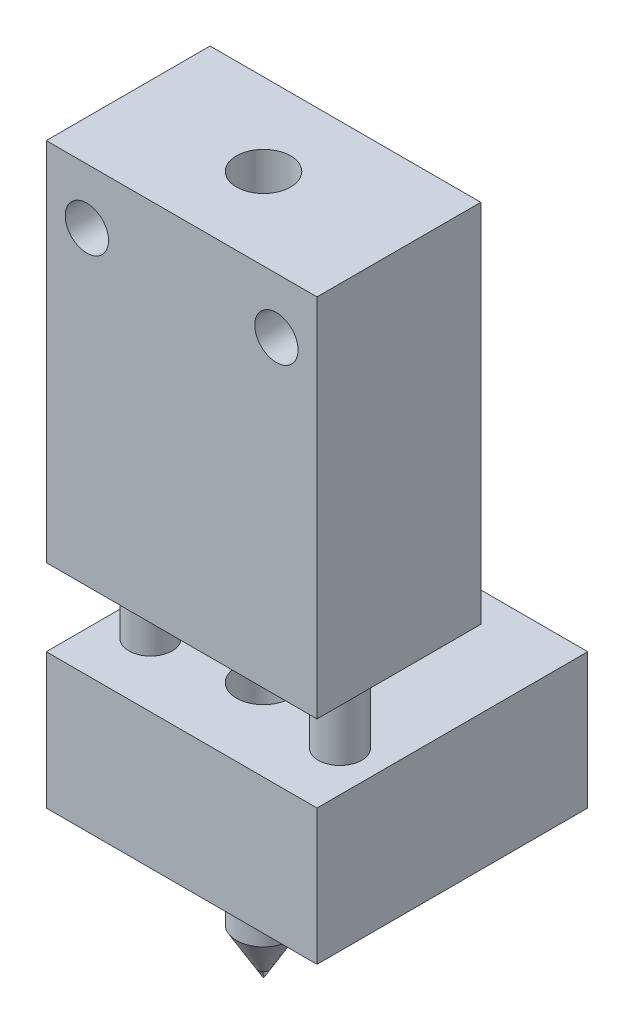
ISO-10303-21;
HEADER;
FILE_DESCRIPTION(('STEP AP214'),'2;1');
FILE_NAME('part.step','',(''),(''),'','','');
FILE_SCHEMA(('AUTOMOTIVE_DESIGN { 1 0 10303 214 1 1 1 1 }'));
ENDSEC;
DATA;
#1=APPLICATION_CONTEXT('core data for automotive mechanical design processes');
#2=APPLICATION_PROTOCOL_DEFINITION('international standard','automotive_design',2000,#1);
#3=PRODUCT_CONTEXT('',#1,'mechanical');
#4=PRODUCT('Part','Part','',(#3));
#5=PRODUCT_RELATED_PRODUCT_CATEGORY('part','',(#4));
#6=PRODUCT_DEFINITION_FORMATION('','',#4);
#7=PRODUCT_DEFINITION_CONTEXT('part definition',#1,'design');
#8=PRODUCT_DEFINITION('design','',#6,#7);
#9=PRODUCT_DEFINITION_SHAPE('','',#8);
#10=(LENGTH_UNIT() NAMED_UNIT(*) SI_UNIT(.MILLI.,.METRE.));
#11=(NAMED_UNIT(*) PLANE_ANGLE_UNIT() SI_UNIT($,.RADIAN.));
#12=(NAMED_UNIT(*) SI_UNIT($,.STERADIAN.) SOLID_ANGLE_UNIT());
#13=UNCERTAINTY_MEASURE_WITH_UNIT(LENGTH_MEASURE(1.E-05),#10,'distance_accuracy_value','');
#14=(GEOMETRIC_REPRESENTATION_CONTEXT(3) GLOBAL_UNCERTAINTY_ASSIGNED_CONTEXT((#13)) GLOBAL_UNIT_ASSIGNED_CONTEXT((#10,
#11,#12)) REPRESENTATION_CONTEXT('',''));
#15=CARTESIAN_POINT('',(0.,0.,0.));
#16=DIRECTION('',(0.,0.,1.));
#17=DIRECTION('',(1.,0.,0.));
#18=AXIS2_PLACEMENT_3D('',#15,#16,#17);
#19=CARTESIAN_POINT('',(0.,-15.7,6.05));
#20=DIRECTION('',(0.,-1.,0.));
#21=DIRECTION('',(1.,0.,0.));
#22=AXIS2_PLACEMENT_3D('',#19,#20,#21);
#23=PLANE('',#22);
#24=CARTESIAN_POINT('',(10.,-15.7,6.05));
#25=DIRECTION('',(0.,1.,0.));
#26=DIRECTION('',(-1.,0.,0.));
#27=AXIS2_PLACEMENT_3D('',#24,#25,#26);
#28=CIRCLE('',#27,2.);
#29=CARTESIAN_POINT('',(8.,-15.7,6.05));
#30=VERTEX_POINT('',#29);
#31=EDGE_CURVE('E12',#30,#30,#28,.T.);
#32=ORIENTED_EDGE('',*,*,#31,.T.);
#33=EDGE_LOOP('',(#32));
#34=FACE_BOUND('',#33,.T.);
#35=ADVANCED_FACE('F45',(#34),#23,.F.);
#36=CARTESIAN_POINT('',(10.,-15.7,6.05));
#37=DIRECTION('',(0.,1.,0.));
#38=DIRECTION('',(-1.,0.,0.));
#39=AXIS2_PLACEMENT_3D('',#36,#37,#38);
#40=CYLINDRICAL_SURFACE('',#39,2.);
#41=CARTESIAN_POINT('',(10.,-21.2,6.05));
#42=DIRECTION('',(0.,1.,0.));
#43=DIRECTION('',(-1.,0.,0.));
#44=AXIS2_PLACEMENT_3D('',#41,#42,#43);
#45=CIRCLE('',#44,2.);
#46=CARTESIAN_POINT('',(8.,-21.2,6.05));
#47=VERTEX_POINT('',#46);
#48=EDGE_CURVE('E51',#47,#47,#45,.T.);
#49=ORIENTED_EDGE('',*,*,#48,.T.);
#50=EDGE_LOOP('',(#49));
#51=FACE_BOUND('',#50,.T.);
#52=ORIENTED_EDGE('',*,*,#31,.F.);
#53=EDGE_LOOP('',(#52));
#54=FACE_BOUND('',#53,.T.);
#55=ADVANCED_FACE('F57',(#51,#54),#40,.T.);
#56=CARTESIAN_POINT('',(10.,-21.2,6.05));
#57=DIRECTION('',(0.,1.,0.));
#58=DIRECTION('',(-1.,0.,0.));
#59=AXIS2_PLACEMENT_3D('',#56,#57,#58);
#60=CONICAL_SURFACE('',#59,2.,0.531724067258806);
#61=CARTESIAN_POINT('',(10.,-24.6,6.05));
#62=VERTEX_POINT('',#61);
#63=VERTEX_LOOP('',#62);
#64=FACE_BOUND('',#63,.T.);
#65=ORIENTED_EDGE('',*,*,#48,.F.);
#66=EDGE_LOOP('',(#65));
#67=FACE_BOUND('',#66,.T.);
#68=ADVANCED_FACE('F54',(#64,#67),#60,.T.);
#69=CLOSED_SHELL('',(#35,#55,#68));
#70=MANIFOLD_SOLID_BREP('B2',#69);
#71=CARTESIAN_POINT('',(0.,0.,12.1));
#72=DIRECTION('',(0.,0.,-1.));
#73=DIRECTION('',(-1.,0.,0.));
#74=AXIS2_PLACEMENT_3D('',#71,#72,#73);
#75=PLANE('',#74);
#76=DIRECTION('',(0.,-1.,0.));
#77=VECTOR('',#76,1.);
#78=CARTESIAN_POINT('',(0.,0.,12.1));
#79=LINE('',#78,#77);
#80=CARTESIAN_POINT('',(0.,27.,12.1));
#81=VERTEX_POINT('',#80);
#82=CARTESIAN_POINT('',(0.,0.,12.1));
#83=VERTEX_POINT('',#82);
#84=EDGE_CURVE('E226',#81,#83,#79,.T.);
#85=ORIENTED_EDGE('',*,*,#84,.T.);
#86=DIRECTION('',(1.,0.,0.));
#87=VECTOR('',#86,1.);
#88=CARTESIAN_POINT('',(0.,0.,12.1));
#89=LINE('',#88,#87);
#90=CARTESIAN_POINT('',(20.,0.,12.1));
#91=VERTEX_POINT('',#90);
#92=EDGE_CURVE('E138',#83,#91,#89,.T.);
#93=ORIENTED_EDGE('',*,*,#92,.T.);
#94=DIRECTION('',(0.,1.,0.));
#95=VECTOR('',#94,1.);
#96=CARTESIAN_POINT('',(20.,0.,12.1));
#97=LINE('',#96,#95);
#98=CARTESIAN_POINT('',(20.,27.,12.1));
#99=VERTEX_POINT('',#98);
#100=EDGE_CURVE('E229',#91,#99,#97,.T.);
#101=ORIENTED_EDGE('',*,*,#100,.T.);
#102=DIRECTION('',(-1.,0.,0.));
#103=VECTOR('',#102,1.);
#104=CARTESIAN_POINT('',(0.,27.,12.1));
#105=LINE('',#104,#103);
#106=EDGE_CURVE('E106',#99,#81,#105,.T.);
#107=ORIENTED_EDGE('',*,*,#106,.T.);
#108=EDGE_LOOP('',(#85,#93,#101,#107));
#109=FACE_BOUND('',#108,.T.);
#110=CARTESIAN_POINT('',(3.,22.9,12.1));
#111=DIRECTION('',(0.,0.,1.));
#112=DIRECTION('',(1.,0.,0.));
#113=AXIS2_PLACEMENT_3D('',#110,#111,#112);
#114=CIRCLE('',#113,1.6);
#115=CARTESIAN_POINT('',(4.6,22.9,12.1));
#116=VERTEX_POINT('',#115);
#117=EDGE_CURVE('E220',#116,#116,#114,.T.);
#118=ORIENTED_EDGE('',*,*,#117,.F.);
#119=EDGE_LOOP('',(#118));
#120=FACE_BOUND('',#119,.T.);
#121=CARTESIAN_POINT('',(17.,22.9,12.1));
#122=DIRECTION('',(0.,0.,1.));
#123=DIRECTION('',(1.,0.,0.));
#124=AXIS2_PLACEMENT_3D('',#121,#122,#123);
#125=CIRCLE('',#124,1.6);
#126=CARTESIAN_POINT('',(18.6,22.9,12.1));
#127=VERTEX_POINT('',#126);
#128=EDGE_CURVE('E214',#127,#127,#125,.T.);
#129=ORIENTED_EDGE('',*,*,#128,.F.);
#130=EDGE_LOOP('',(#129));
#131=FACE_BOUND('',#130,.T.);
#132=ADVANCED_FACE('F88',(#109,#120,#131),#75,.F.);
#133=CARTESIAN_POINT('',(0.,0.,0.));
#134=DIRECTION('',(0.,0.,-1.));
#135=DIRECTION('',(-1.,0.,0.));
#136=AXIS2_PLACEMENT_3D('',#133,#134,#135);
#137=PLANE('',#136);
#138=CARTESIAN_POINT('',(3.,22.9,0.));
#139=DIRECTION('',(0.,0.,1.));
#140=DIRECTION('',(1.,0.,0.));
#141=AXIS2_PLACEMENT_3D('',#138,#139,#140);
#142=CIRCLE('',#141,1.6);
#143=CARTESIAN_POINT('',(4.6,22.9,0.));
#144=VERTEX_POINT('',#143);
#145=EDGE_CURVE('E217',#144,#144,#142,.T.);
#146=ORIENTED_EDGE('',*,*,#145,.T.);
#147=EDGE_LOOP('',(#146));
#148=FACE_BOUND('',#147,.T.);
#149=DIRECTION('',(0.,-1.,0.));
#150=VECTOR('',#149,1.);
#151=CARTESIAN_POINT('',(0.,0.,0.));
#152=LINE('',#151,#150);
#153=CARTESIAN_POINT('',(0.,27.,0.));
#154=VERTEX_POINT('',#153);
#155=CARTESIAN_POINT('',(0.,0.,0.));
#156=VERTEX_POINT('',#155);
#157=EDGE_CURVE('E223',#154,#156,#152,.T.);
#158=ORIENTED_EDGE('',*,*,#157,.F.);
#159=DIRECTION('',(-1.,0.,0.));
#160=VECTOR('',#159,1.);
#161=CARTESIAN_POINT('',(0.,27.,0.));
#162=LINE('',#161,#160);
#163=CARTESIAN_POINT('',(20.,27.,0.));
#164=VERTEX_POINT('',#163);
#165=EDGE_CURVE('E130',#164,#154,#162,.T.);
#166=ORIENTED_EDGE('',*,*,#165,.F.);
#167=DIRECTION('',(0.,1.,0.));
#168=VECTOR('',#167,1.);
#169=CARTESIAN_POINT('',(20.,0.,0.));
#170=LINE('',#169,#168);
#171=CARTESIAN_POINT('',(20.,0.,0.));
#172=VERTEX_POINT('',#171);
#173=EDGE_CURVE('E124',#172,#164,#170,.T.);
#174=ORIENTED_EDGE('',*,*,#173,.F.);
#175=DIRECTION('',(1.,0.,0.));
#176=VECTOR('',#175,1.);
#177=CARTESIAN_POINT('',(0.,0.,0.));
#178=LINE('',#177,#176);
#179=EDGE_CURVE('E235',#156,#172,#178,.T.);
#180=ORIENTED_EDGE('',*,*,#179,.F.);
#181=EDGE_LOOP('',(#158,#166,#174,#180));
#182=FACE_BOUND('',#181,.T.);
#183=CARTESIAN_POINT('',(17.,22.9,0.));
#184=DIRECTION('',(0.,0.,1.));
#185=DIRECTION('',(1.,0.,0.));
#186=AXIS2_PLACEMENT_3D('',#183,#184,#185);
#187=CIRCLE('',#186,1.6);
#188=CARTESIAN_POINT('',(18.6,22.9,0.));
#189=VERTEX_POINT('',#188);
#190=EDGE_CURVE('E213',#189,#189,#187,.T.);
#191=ORIENTED_EDGE('',*,*,#190,.T.);
#192=EDGE_LOOP('',(#191));
#193=FACE_BOUND('',#192,.T.);
#194=ADVANCED_FACE('F259',(#148,#182,#193),#137,.T.);
#195=CARTESIAN_POINT('',(0.,0.,12.1));
#196=DIRECTION('',(1.,0.,0.));
#197=DIRECTION('',(0.,1.,0.));
#198=AXIS2_PLACEMENT_3D('',#195,#196,#197);
#199=PLANE('',#198);
#200=ORIENTED_EDGE('',*,*,#157,.T.);
#201=DIRECTION('',(0.,0.,-1.));
#202=VECTOR('',#201,1.);
#203=CARTESIAN_POINT('',(0.,0.,12.1));
#204=LINE('',#203,#202);
#205=EDGE_CURVE('E244',#83,#156,#204,.T.);
#206=ORIENTED_EDGE('',*,*,#205,.F.);
#207=ORIENTED_EDGE('',*,*,#84,.F.);
#208=DIRECTION('',(0.,0.,-1.));
#209=VECTOR('',#208,1.);
#210=CARTESIAN_POINT('',(0.,27.,12.1));
#211=LINE('',#210,#209);
#212=EDGE_CURVE('E232',#81,#154,#211,.T.);
#213=ORIENTED_EDGE('',*,*,#212,.T.);
#214=EDGE_LOOP('',(#200,#206,#207,#213));
#215=FACE_BOUND('',#214,.T.);
#216=ADVANCED_FACE('F90',(#215),#199,.F.);
#217=CARTESIAN_POINT('',(0.,0.,12.1));
#218=DIRECTION('',(0.,1.,0.));
#219=DIRECTION('',(0.,0.,1.));
#220=AXIS2_PLACEMENT_3D('',#217,#218,#219);
#221=PLANE('',#220);
#222=CARTESIAN_POINT('',(10.,0.,6.05));
#223=DIRECTION('',(0.,1.,0.));
#224=DIRECTION('',(0.,0.,1.));
#225=AXIS2_PLACEMENT_3D('',#222,#223,#224);
#226=CIRCLE('',#225,2.);
#227=CARTESIAN_POINT('',(10.,0.,8.05));
#228=VERTEX_POINT('',#227);
#229=EDGE_CURVE('E331',#228,#228,#226,.T.);
#230=ORIENTED_EDGE('',*,*,#229,.T.);
#231=EDGE_LOOP('',(#230));
#232=FACE_BOUND('',#231,.T.);
#233=CARTESIAN_POINT('',(17.,0.,7.4));
#234=DIRECTION('',(0.,1.,0.));
#235=DIRECTION('',(0.,0.,1.));
#236=AXIS2_PLACEMENT_3D('',#233,#234,#235);
#237=CIRCLE('',#236,1.6);
#238=CARTESIAN_POINT('',(17.,0.,9.));
#239=VERTEX_POINT('',#238);
#240=EDGE_CURVE('E43',#239,#239,#237,.F.);
#241=ORIENTED_EDGE('',*,*,#240,.F.);
#242=EDGE_LOOP('',(#241));
#243=FACE_BOUND('',#242,.T.);
#244=CARTESIAN_POINT('',(3.,0.,7.4));
#245=DIRECTION('',(0.,1.,0.));
#246=DIRECTION('',(0.,0.,1.));
#247=AXIS2_PLACEMENT_3D('',#244,#245,#246);
#248=CIRCLE('',#247,1.6);
#249=CARTESIAN_POINT('',(3.,0.,9.));
#250=VERTEX_POINT('',#249);
#251=EDGE_CURVE('E98',#250,#250,#248,.F.);
#252=ORIENTED_EDGE('',*,*,#251,.F.);
#253=EDGE_LOOP('',(#252));
#254=FACE_BOUND('',#253,.T.);
#255=ORIENTED_EDGE('',*,*,#179,.T.);
#256=DIRECTION('',(0.,0.,-1.));
#257=VECTOR('',#256,1.);
#258=CARTESIAN_POINT('',(20.,0.,12.1));
#259=LINE('',#258,#257);
#260=EDGE_CURVE('E242',#91,#172,#259,.T.);
#261=ORIENTED_EDGE('',*,*,#260,.F.);
#262=ORIENTED_EDGE('',*,*,#92,.F.);
#263=ORIENTED_EDGE('',*,*,#205,.T.);
#264=EDGE_LOOP('',(#255,#261,#262,#263));
#265=FACE_BOUND('',#264,.T.);
#266=ADVANCED_FACE('F251',(#232,#243,#254,#265),#221,.F.);
#267=CARTESIAN_POINT('',(20.,0.,12.1));
#268=DIRECTION('',(-1.,0.,0.));
#269=DIRECTION('',(0.,-1.,0.));
#270=AXIS2_PLACEMENT_3D('',#267,#268,#269);
#271=PLANE('',#270);
#272=ORIENTED_EDGE('',*,*,#173,.T.);
#273=DIRECTION('',(0.,0.,-1.));
#274=VECTOR('',#273,1.);
#275=CARTESIAN_POINT('',(20.,27.,12.1));
#276=LINE('',#275,#274);
#277=EDGE_CURVE('E240',#99,#164,#276,.T.);
#278=ORIENTED_EDGE('',*,*,#277,.F.);
#279=ORIENTED_EDGE('',*,*,#100,.F.);
#280=ORIENTED_EDGE('',*,*,#260,.T.);
#281=EDGE_LOOP('',(#272,#278,#279,#280));
#282=FACE_BOUND('',#281,.T.);
#283=ADVANCED_FACE('F253',(#282),#271,.F.);
#284=CARTESIAN_POINT('',(0.,27.,12.1));
#285=DIRECTION('',(0.,-1.,0.));
#286=DIRECTION('',(0.,0.,-1.));
#287=AXIS2_PLACEMENT_3D('',#284,#285,#286);
#288=PLANE('',#287);
#289=CARTESIAN_POINT('',(10.,27.,6.05));
#290=DIRECTION('',(0.,1.,0.));
#291=DIRECTION('',(0.,0.,1.));
#292=AXIS2_PLACEMENT_3D('',#289,#290,#291);
#293=CIRCLE('',#292,2.);
#294=CARTESIAN_POINT('',(10.,27.,8.05));
#295=VERTEX_POINT('',#294);
#296=EDGE_CURVE('E329',#295,#295,#293,.T.);
#297=ORIENTED_EDGE('',*,*,#296,.F.);
#298=EDGE_LOOP('',(#297));
#299=FACE_BOUND('',#298,.T.);
#300=ORIENTED_EDGE('',*,*,#165,.T.);
#301=ORIENTED_EDGE('',*,*,#212,.F.);
#302=ORIENTED_EDGE('',*,*,#106,.F.);
#303=ORIENTED_EDGE('',*,*,#277,.T.);
#304=EDGE_LOOP('',(#300,#301,#302,#303));
#305=FACE_BOUND('',#304,.T.);
#306=ADVANCED_FACE('F263',(#299,#305),#288,.F.);
#307=CARTESIAN_POINT('',(3.,22.9,12.1));
#308=DIRECTION('',(0.,0.,-1.));
#309=DIRECTION('',(-1.,0.,0.));
#310=AXIS2_PLACEMENT_3D('',#307,#308,#309);
#311=CYLINDRICAL_SURFACE('',#310,1.6);
#312=ORIENTED_EDGE('',*,*,#117,.T.);
#313=EDGE_LOOP('',(#312));
#314=FACE_BOUND('',#313,.T.);
#315=ORIENTED_EDGE('',*,*,#145,.F.);
#316=EDGE_LOOP('',(#315));
#317=FACE_BOUND('',#316,.T.);
#318=ADVANCED_FACE('F265',(#314,#317),#311,.F.);
#319=CARTESIAN_POINT('',(17.,22.9,12.1));
#320=DIRECTION('',(0.,0.,-1.));
#321=DIRECTION('',(-1.,0.,0.));
#322=AXIS2_PLACEMENT_3D('',#319,#320,#321);
#323=CYLINDRICAL_SURFACE('',#322,1.6);
#324=ORIENTED_EDGE('',*,*,#128,.T.);
#325=EDGE_LOOP('',(#324));
#326=FACE_BOUND('',#325,.T.);
#327=ORIENTED_EDGE('',*,*,#190,.F.);
#328=EDGE_LOOP('',(#327));
#329=FACE_BOUND('',#328,.T.);
#330=ADVANCED_FACE('F272',(#326,#329),#323,.F.);
#331=CARTESIAN_POINT('',(3.,-15.702,7.4));
#332=DIRECTION('',(0.,1.,0.));
#333=DIRECTION('',(0.,0.,1.));
#334=AXIS2_PLACEMENT_3D('',#331,#332,#333);
#335=CYLINDRICAL_SURFACE('',#334,1.6);
#336=CARTESIAN_POINT('',(3.,-5.7,7.4));
#337=DIRECTION('',(0.,1.,0.));
#338=DIRECTION('',(0.,0.,1.));
#339=AXIS2_PLACEMENT_3D('',#336,#337,#338);
#340=CIRCLE('',#339,1.6);
#341=CARTESIAN_POINT('',(3.,-5.7,9.));
#342=VERTEX_POINT('',#341);
#343=EDGE_CURVE('E207',#342,#342,#340,.T.);
#344=ORIENTED_EDGE('',*,*,#343,.T.);
#345=EDGE_LOOP('',(#344));
#346=FACE_BOUND('',#345,.T.);
#347=ORIENTED_EDGE('',*,*,#251,.T.);
#348=EDGE_LOOP('',(#347));
#349=FACE_BOUND('',#348,.T.);
#350=ADVANCED_FACE('F249',(#346,#349),#335,.T.);
#351=CARTESIAN_POINT('',(20.,-15.7,12.1));
#352=DIRECTION('',(0.,0.,1.));
#353=DIRECTION('',(1.,0.,0.));
#354=AXIS2_PLACEMENT_3D('',#351,#352,#353);
#355=PLANE('',#354);
#356=DIRECTION('',(0.,1.,0.));
#357=VECTOR('',#356,1.);
#358=CARTESIAN_POINT('',(0.,-15.7,12.1));
#359=LINE('',#358,#357);
#360=CARTESIAN_POINT('',(0.,-15.7,12.1));
#361=VERTEX_POINT('',#360);
#362=CARTESIAN_POINT('',(0.,-5.7,12.1));
#363=VERTEX_POINT('',#362);
#364=EDGE_CURVE('E201',#361,#363,#359,.T.);
#365=ORIENTED_EDGE('',*,*,#364,.F.);
#366=DIRECTION('',(-1.,0.,0.));
#367=VECTOR('',#366,1.);
#368=CARTESIAN_POINT('',(20.,-15.7,12.1));
#369=LINE('',#368,#367);
#370=CARTESIAN_POINT('',(20.,-15.7,12.1));
#371=VERTEX_POINT('',#370);
#372=EDGE_CURVE('E189',#371,#361,#369,.T.);
#373=ORIENTED_EDGE('',*,*,#372,.F.);
#374=DIRECTION('',(0.,1.,0.));
#375=VECTOR('',#374,1.);
#376=CARTESIAN_POINT('',(20.,-15.7,12.1));
#377=LINE('',#376,#375);
#378=CARTESIAN_POINT('',(20.,-5.7,12.1));
#379=VERTEX_POINT('',#378);
#380=EDGE_CURVE('E183',#371,#379,#377,.T.);
#381=ORIENTED_EDGE('',*,*,#380,.T.);
#382=DIRECTION('',(-1.,0.,0.));
#383=VECTOR('',#382,1.);
#384=CARTESIAN_POINT('',(20.,-5.7,12.1));
#385=LINE('',#384,#383);
#386=EDGE_CURVE('E165',#379,#363,#385,.T.);
#387=ORIENTED_EDGE('',*,*,#386,.T.);
#388=EDGE_LOOP('',(#365,#373,#381,#387));
#389=FACE_BOUND('',#388,.T.);
#390=ADVANCED_FACE('F188',(#389),#355,.T.);
#391=CARTESIAN_POINT('',(20.,-15.7,12.1));
#392=DIRECTION('',(0.,-1.,0.));
#393=DIRECTION('',(0.,0.,-1.));
#394=AXIS2_PLACEMENT_3D('',#391,#392,#393);
#395=PLANE('',#394);
#396=CARTESIAN_POINT('',(10.,-15.7,6.05));
#397=DIRECTION('',(0.,-1.,0.));
#398=DIRECTION('',(0.,0.,-1.));
#399=AXIS2_PLACEMENT_3D('',#396,#397,#398);
#400=CIRCLE('',#399,2.);
#401=CARTESIAN_POINT('',(10.,-15.7,4.05));
#402=VERTEX_POINT('',#401);
#403=EDGE_CURVE('E328',#402,#402,#400,.F.);
#404=ORIENTED_EDGE('',*,*,#403,.T.);
#405=EDGE_LOOP('',(#404));
#406=FACE_BOUND('',#405,.T.);
#407=DIRECTION('',(0.,0.,1.));
#408=VECTOR('',#407,1.);
#409=CARTESIAN_POINT('',(0.,-15.7,12.1));
#410=LINE('',#409,#408);
#411=CARTESIAN_POINT('',(0.,-15.7,-7.9));
#412=VERTEX_POINT('',#411);
#413=EDGE_CURVE('E190',#412,#361,#410,.T.);
#414=ORIENTED_EDGE('',*,*,#413,.F.);
#415=DIRECTION('',(-1.,0.,0.));
#416=VECTOR('',#415,1.);
#417=CARTESIAN_POINT('',(20.,-15.7,-7.9));
#418=LINE('',#417,#416);
#419=CARTESIAN_POINT('',(20.,-15.7,-7.9));
#420=VERTEX_POINT('',#419);
#421=EDGE_CURVE('E208',#420,#412,#418,.T.);
#422=ORIENTED_EDGE('',*,*,#421,.F.);
#423=DIRECTION('',(0.,0.,1.));
#424=VECTOR('',#423,1.);
#425=CARTESIAN_POINT('',(20.,-15.7,12.1));
#426=LINE('',#425,#424);
#427=EDGE_CURVE('E176',#420,#371,#426,.T.);
#428=ORIENTED_EDGE('',*,*,#427,.T.);
#429=ORIENTED_EDGE('',*,*,#372,.T.);
#430=EDGE_LOOP('',(#414,#422,#428,#429));
#431=FACE_BOUND('',#430,.T.);
#432=ADVANCED_FACE('F294',(#406,#431),#395,.T.);
#433=CARTESIAN_POINT('',(20.,-15.7,-7.9));
#434=DIRECTION('',(0.,0.,-1.));
#435=DIRECTION('',(-1.,0.,0.));
#436=AXIS2_PLACEMENT_3D('',#433,#434,#435);
#437=PLANE('',#436);
#438=DIRECTION('',(0.,-1.,0.));
#439=VECTOR('',#438,1.);
#440=CARTESIAN_POINT('',(0.,-15.7,-7.9));
#441=LINE('',#440,#439);
#442=CARTESIAN_POINT('',(0.,-5.7,-7.9));
#443=VERTEX_POINT('',#442);
#444=EDGE_CURVE('E193',#443,#412,#441,.T.);
#445=ORIENTED_EDGE('',*,*,#444,.F.);
#446=DIRECTION('',(-1.,0.,0.));
#447=VECTOR('',#446,1.);
#448=CARTESIAN_POINT('',(20.,-5.7,-7.9));
#449=LINE('',#448,#447);
#450=CARTESIAN_POINT('',(20.,-5.7,-7.9));
#451=VERTEX_POINT('',#450);
#452=EDGE_CURVE('E175',#451,#443,#449,.T.);
#453=ORIENTED_EDGE('',*,*,#452,.F.);
#454=DIRECTION('',(0.,-1.,0.));
#455=VECTOR('',#454,1.);
#456=CARTESIAN_POINT('',(20.,-15.7,-7.9));
#457=LINE('',#456,#455);
#458=EDGE_CURVE('E186',#451,#420,#457,.T.);
#459=ORIENTED_EDGE('',*,*,#458,.T.);
#460=ORIENTED_EDGE('',*,*,#421,.T.);
#461=EDGE_LOOP('',(#445,#453,#459,#460));
#462=FACE_BOUND('',#461,.T.);
#463=ADVANCED_FACE('F297',(#462),#437,.T.);
#464=CARTESIAN_POINT('',(20.,-5.7,12.1));
#465=DIRECTION('',(0.,1.,0.));
#466=DIRECTION('',(0.,0.,1.));
#467=AXIS2_PLACEMENT_3D('',#464,#465,#466);
#468=PLANE('',#467);
#469=CARTESIAN_POINT('',(10.,-5.7,6.05));
#470=DIRECTION('',(0.,1.,0.));
#471=DIRECTION('',(0.,0.,1.));
#472=AXIS2_PLACEMENT_3D('',#469,#470,#471);
#473=CIRCLE('',#472,2.);
#474=CARTESIAN_POINT('',(10.,-5.7,8.05));
#475=VERTEX_POINT('',#474);
#476=EDGE_CURVE('E92',#475,#475,#473,.T.);
#477=ORIENTED_EDGE('',*,*,#476,.F.);
#478=EDGE_LOOP('',(#477));
#479=FACE_BOUND('',#478,.T.);
#480=CARTESIAN_POINT('',(17.,-5.7,7.4));
#481=DIRECTION('',(0.,1.,0.));
#482=DIRECTION('',(0.,0.,1.));
#483=AXIS2_PLACEMENT_3D('',#480,#481,#482);
#484=CIRCLE('',#483,1.6);
#485=CARTESIAN_POINT('',(17.,-5.7,9.));
#486=VERTEX_POINT('',#485);
#487=EDGE_CURVE('E196',#486,#486,#484,.T.);
#488=ORIENTED_EDGE('',*,*,#487,.F.);
#489=EDGE_LOOP('',(#488));
#490=FACE_BOUND('',#489,.T.);
#491=ORIENTED_EDGE('',*,*,#343,.F.);
#492=EDGE_LOOP('',(#491));
#493=FACE_BOUND('',#492,.T.);
#494=DIRECTION('',(0.,0.,-1.));
#495=VECTOR('',#494,1.);
#496=CARTESIAN_POINT('',(0.,-5.7,12.1));
#497=LINE('',#496,#495);
#498=EDGE_CURVE('E170',#363,#443,#497,.T.);
#499=ORIENTED_EDGE('',*,*,#498,.F.);
#500=ORIENTED_EDGE('',*,*,#386,.F.);
#501=DIRECTION('',(0.,0.,-1.));
#502=VECTOR('',#501,1.);
#503=CARTESIAN_POINT('',(20.,-5.7,12.1));
#504=LINE('',#503,#502);
#505=EDGE_CURVE('E168',#379,#451,#504,.T.);
#506=ORIENTED_EDGE('',*,*,#505,.T.);
#507=ORIENTED_EDGE('',*,*,#452,.T.);
#508=EDGE_LOOP('',(#499,#500,#506,#507));
#509=FACE_BOUND('',#508,.T.);
#510=ADVANCED_FACE('F167',(#479,#490,#493,#509),#468,.T.);
#511=CARTESIAN_POINT('',(20.,0.,0.));
#512=DIRECTION('',(-1.,0.,0.));
#513=DIRECTION('',(0.,-1.,0.));
#514=AXIS2_PLACEMENT_3D('',#511,#512,#513);
#515=PLANE('',#514);
#516=ORIENTED_EDGE('',*,*,#380,.F.);
#517=ORIENTED_EDGE('',*,*,#427,.F.);
#518=ORIENTED_EDGE('',*,*,#458,.F.);
#519=ORIENTED_EDGE('',*,*,#505,.F.);
#520=EDGE_LOOP('',(#516,#517,#518,#519));
#521=FACE_BOUND('',#520,.T.);
#522=ADVANCED_FACE('F181',(#521),#515,.F.);
#523=CARTESIAN_POINT('',(0.,0.,0.));
#524=DIRECTION('',(-1.,0.,0.));
#525=DIRECTION('',(0.,-1.,0.));
#526=AXIS2_PLACEMENT_3D('',#523,#524,#525);
#527=PLANE('',#526);
#528=ORIENTED_EDGE('',*,*,#364,.T.);
#529=ORIENTED_EDGE('',*,*,#498,.T.);
#530=ORIENTED_EDGE('',*,*,#444,.T.);
#531=ORIENTED_EDGE('',*,*,#413,.T.);
#532=EDGE_LOOP('',(#528,#529,#530,#531));
#533=FACE_BOUND('',#532,.T.);
#534=ADVANCED_FACE('F305',(#533),#527,.T.);
#535=CARTESIAN_POINT('',(17.,-15.702,7.4));
#536=DIRECTION('',(0.,1.,0.));
#537=DIRECTION('',(0.,0.,1.));
#538=AXIS2_PLACEMENT_3D('',#535,#536,#537);
#539=CYLINDRICAL_SURFACE('',#538,1.6);
#540=ORIENTED_EDGE('',*,*,#487,.T.);
#541=EDGE_LOOP('',(#540));
#542=FACE_BOUND('',#541,.T.);
#543=ORIENTED_EDGE('',*,*,#240,.T.);
#544=EDGE_LOOP('',(#543));
#545=FACE_BOUND('',#544,.T.);
#546=ADVANCED_FACE('F308',(#542,#545),#539,.T.);
#547=CARTESIAN_POINT('',(10.,-21.3568542494924,6.05));
#548=DIRECTION('',(0.,1.,0.));
#549=DIRECTION('',(0.,0.,1.));
#550=AXIS2_PLACEMENT_3D('',#547,#548,#549);
#551=CYLINDRICAL_SURFACE('',#550,2.);
#552=ORIENTED_EDGE('',*,*,#476,.T.);
#553=EDGE_LOOP('',(#552));
#554=FACE_BOUND('',#553,.T.);
#555=ORIENTED_EDGE('',*,*,#403,.F.);
#556=EDGE_LOOP('',(#555));
#557=FACE_BOUND('',#556,.T.);
#558=ADVANCED_FACE('F314',(#554,#557),#551,.F.);
#559=ORIENTED_EDGE('',*,*,#296,.T.);
#560=EDGE_LOOP('',(#559));
#561=FACE_BOUND('',#560,.T.);
#562=ORIENTED_EDGE('',*,*,#229,.F.);
#563=EDGE_LOOP('',(#562));
#564=FACE_BOUND('',#563,.T.);
#565=ADVANCED_FACE('F317',(#561,#564),#551,.F.);
#566=CLOSED_SHELL('',(#132,#194,#216,#266,#283,#306,#318,#330,#350,#390,#432,#463,#510,#522,
#534,#546,#558,#565));
#567=MANIFOLD_SOLID_BREP('B6',#566);
#568=ADVANCED_BREP_SHAPE_REPRESENTATION('',(#18,#70,#567),#14);
#569=SHAPE_DEFINITION_REPRESENTATION(#9,#568);
ENDSEC;
END-ISO-10303-21;
